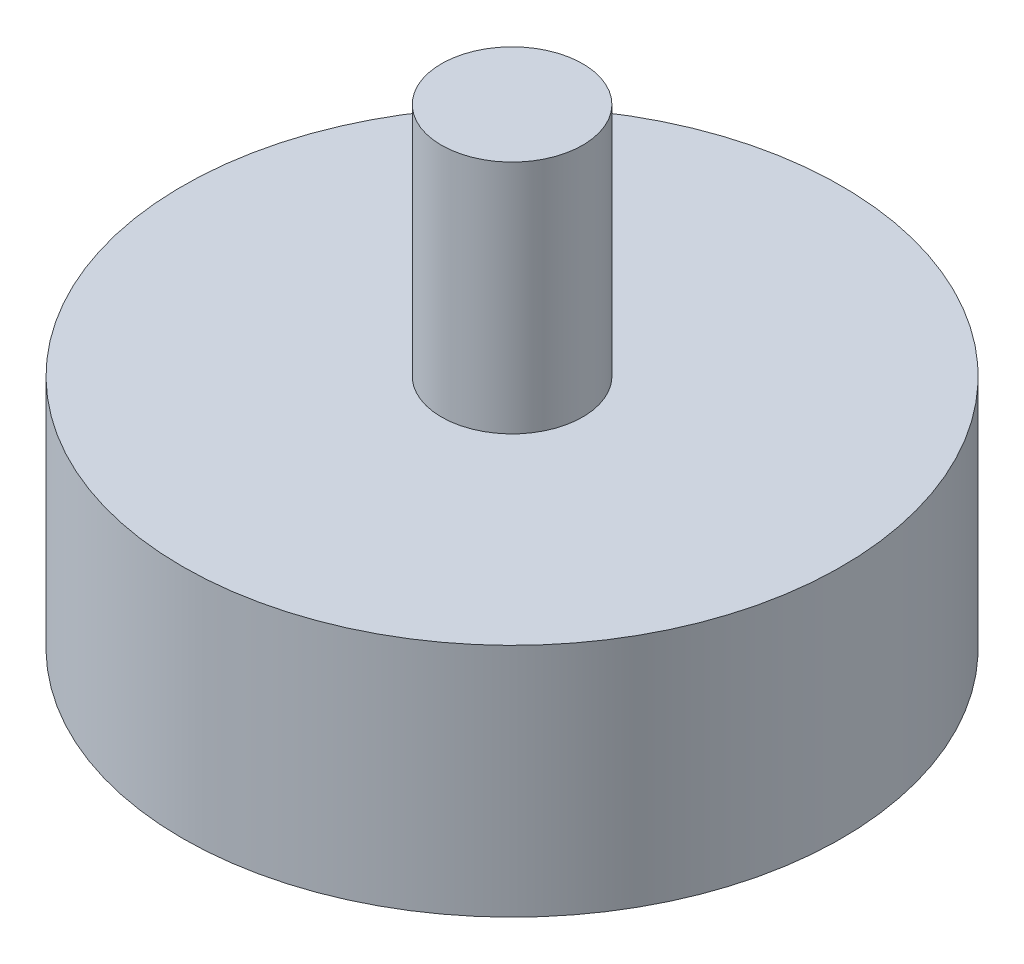
ISO-10303-21;
HEADER;
FILE_DESCRIPTION(('STEP AP214'),'2;1');
FILE_NAME('part.step','',(''),(''),'','','');
FILE_SCHEMA(('AUTOMOTIVE_DESIGN { 1 0 10303 214 1 1 1 1 }'));
ENDSEC;
DATA;
#1=APPLICATION_CONTEXT('core data for automotive mechanical design processes');
#2=APPLICATION_PROTOCOL_DEFINITION('international standard','automotive_design',2000,#1);
#3=PRODUCT_CONTEXT('',#1,'mechanical');
#4=PRODUCT('Part','Part','',(#3));
#5=PRODUCT_RELATED_PRODUCT_CATEGORY('part','',(#4));
#6=PRODUCT_DEFINITION_FORMATION('','',#4);
#7=PRODUCT_DEFINITION_CONTEXT('part definition',#1,'design');
#8=PRODUCT_DEFINITION('design','',#6,#7);
#9=PRODUCT_DEFINITION_SHAPE('','',#8);
#10=(LENGTH_UNIT() NAMED_UNIT(*) SI_UNIT(.MILLI.,.METRE.));
#11=(NAMED_UNIT(*) PLANE_ANGLE_UNIT() SI_UNIT($,.RADIAN.));
#12=(NAMED_UNIT(*) SI_UNIT($,.STERADIAN.) SOLID_ANGLE_UNIT());
#13=UNCERTAINTY_MEASURE_WITH_UNIT(LENGTH_MEASURE(1.E-05),#10,'distance_accuracy_value','');
#14=(GEOMETRIC_REPRESENTATION_CONTEXT(3) GLOBAL_UNCERTAINTY_ASSIGNED_CONTEXT((#13)) GLOBAL_UNIT_ASSIGNED_CONTEXT((#10,
#11,#12)) REPRESENTATION_CONTEXT('',''));
#15=CARTESIAN_POINT('',(0.,0.,0.));
#16=DIRECTION('',(0.,0.,1.));
#17=DIRECTION('',(1.,0.,0.));
#18=AXIS2_PLACEMENT_3D('',#15,#16,#17);
#19=CARTESIAN_POINT('',(0.,50.,0.));
#20=DIRECTION('',(0.,-1.,0.));
#21=DIRECTION('',(0.,0.,-1.));
#22=AXIS2_PLACEMENT_3D('',#19,#20,#21);
#23=CYLINDRICAL_SURFACE('',#22,70.);
#24=CARTESIAN_POINT('',(0.,50.,0.));
#25=DIRECTION('',(0.,1.,0.));
#26=DIRECTION('',(0.,0.,1.));
#27=AXIS2_PLACEMENT_3D('',#24,#25,#26);
#28=CIRCLE('',#27,70.);
#29=CARTESIAN_POINT('',(0.,50.,70.));
#30=VERTEX_POINT('',#29);
#31=EDGE_CURVE('E46',#30,#30,#28,.T.);
#32=ORIENTED_EDGE('',*,*,#31,.F.);
#33=EDGE_LOOP('',(#32));
#34=FACE_BOUND('',#33,.T.);
#35=CARTESIAN_POINT('',(0.,0.,0.));
#36=DIRECTION('',(0.,1.,0.));
#37=DIRECTION('',(0.,0.,1.));
#38=AXIS2_PLACEMENT_3D('',#35,#36,#37);
#39=CIRCLE('',#38,70.);
#40=CARTESIAN_POINT('',(0.,0.,70.));
#41=VERTEX_POINT('',#40);
#42=EDGE_CURVE('E41',#41,#41,#39,.T.);
#43=ORIENTED_EDGE('',*,*,#42,.T.);
#44=EDGE_LOOP('',(#43));
#45=FACE_BOUND('',#44,.T.);
#46=ADVANCED_FACE('F38',(#34,#45),#23,.T.);
#47=CARTESIAN_POINT('',(0.,50.,0.));
#48=DIRECTION('',(0.,1.,0.));
#49=DIRECTION('',(0.,0.,1.));
#50=AXIS2_PLACEMENT_3D('',#47,#48,#49);
#51=PLANE('',#50);
#52=CARTESIAN_POINT('',(0.,50.,0.));
#53=DIRECTION('',(0.,1.,0.));
#54=DIRECTION('',(0.,0.,1.));
#55=AXIS2_PLACEMENT_3D('',#52,#53,#54);
#56=CIRCLE('',#55,15.);
#57=CARTESIAN_POINT('',(0.,50.,15.));
#58=VERTEX_POINT('',#57);
#59=EDGE_CURVE('E11',#58,#58,#56,.T.);
#60=ORIENTED_EDGE('',*,*,#59,.F.);
#61=EDGE_LOOP('',(#60));
#62=FACE_BOUND('',#61,.T.);
#63=ORIENTED_EDGE('',*,*,#31,.T.);
#64=EDGE_LOOP('',(#63));
#65=FACE_BOUND('',#64,.T.);
#66=ADVANCED_FACE('F202',(#62,#65),#51,.T.);
#67=CARTESIAN_POINT('',(0.,0.,0.));
#68=DIRECTION('',(0.,1.,0.));
#69=DIRECTION('',(0.,0.,1.));
#70=AXIS2_PLACEMENT_3D('',#67,#68,#69);
#71=PLANE('',#70);
#72=DIRECTION('',(-0.589540314689546,0.,-0.807738953719425));
#73=VECTOR('',#72,1.);
#74=CARTESIAN_POINT('',(-20.1581224957302,0.,-16.5040988934656));
#75=LINE('',#74,#73);
#76=CARTESIAN_POINT('',(0.,0.,11.11487875393));
#77=VERTEX_POINT('',#76);
#78=CARTESIAN_POINT('',(-20.1581224957302,0.,-16.5040988934656));
#79=VERTEX_POINT('',#78);
#80=EDGE_CURVE('E152',#77,#79,#75,.T.);
#81=ORIENTED_EDGE('',*,*,#80,.F.);
#82=DIRECTION('',(1.,0.,0.));
#83=VECTOR('',#82,1.);
#84=CARTESIAN_POINT('',(0.,0.,11.11487875393));
#85=LINE('',#84,#83);
#86=CARTESIAN_POINT('',(-16.1920608767958,0.,11.11487875393));
#87=VERTEX_POINT('',#86);
#88=EDGE_CURVE('E54',#87,#77,#85,.T.);
#89=ORIENTED_EDGE('',*,*,#88,.F.);
#90=DIRECTION('',(-0.675312692510139,0.,-0.7375315365018));
#91=VECTOR('',#90,1.);
#92=CARTESIAN_POINT('',(-16.1920608767958,0.,11.11487875393));
#93=LINE('',#92,#91);
#94=CARTESIAN_POINT('',(27.54081994348,0.,58.8770179003727));
#95=VERTEX_POINT('',#94);
#96=EDGE_CURVE('E173',#95,#87,#93,.T.);
#97=ORIENTED_EDGE('',*,*,#96,.F.);
#98=DIRECTION('',(0.399355986863506,0.,0.916795940084965));
#99=VECTOR('',#98,1.);
#100=CARTESIAN_POINT('',(27.54081994348,0.,58.8770179003727));
#101=LINE('',#100,#99);
#102=CARTESIAN_POINT('',(10.1115671953132,0.,18.864926723947));
#103=VERTEX_POINT('',#102);
#104=EDGE_CURVE('E171',#103,#95,#101,.T.);
#105=ORIENTED_EDGE('',*,*,#104,.F.);
#106=DIRECTION('',(-1.,0.,0.));
#107=VECTOR('',#106,1.);
#108=CARTESIAN_POINT('',(10.1115671953132,0.,18.864926723947));
#109=LINE('',#108,#107);
#110=CARTESIAN_POINT('',(21.8812078758533,0.,18.864926723947));
#111=VERTEX_POINT('',#110);
#112=EDGE_CURVE('E126',#111,#103,#109,.T.);
#113=ORIENTED_EDGE('',*,*,#112,.F.);
#114=DIRECTION('',(0.589540314689546,0.,0.807738953719425));
#115=VECTOR('',#114,1.);
#116=CARTESIAN_POINT('',(21.8812078758533,0.,18.864926723947));
#117=LINE('',#116,#115);
#118=CARTESIAN_POINT('',(0.,0.,-11.11487875393));
#119=VERTEX_POINT('',#118);
#120=EDGE_CURVE('E167',#119,#111,#117,.T.);
#121=ORIENTED_EDGE('',*,*,#120,.F.);
#122=DIRECTION('',(-1.,0.,0.));
#123=VECTOR('',#122,1.);
#124=CARTESIAN_POINT('',(0.,0.,-11.11487875393));
#125=LINE('',#124,#123);
#126=CARTESIAN_POINT('',(16.1920608767958,0.,-11.11487875393));
#127=VERTEX_POINT('',#126);
#128=EDGE_CURVE('E164',#127,#119,#125,.T.);
#129=ORIENTED_EDGE('',*,*,#128,.F.);
#130=DIRECTION('',(0.675312692510139,0.,0.7375315365018));
#131=VECTOR('',#130,1.);
#132=CARTESIAN_POINT('',(16.1920608767958,0.,-11.11487875393));
#133=LINE('',#132,#131);
#134=CARTESIAN_POINT('',(-27.54081994348,0.,-58.8770179003727));
#135=VERTEX_POINT('',#134);
#136=EDGE_CURVE('E161',#135,#127,#133,.T.);
#137=ORIENTED_EDGE('',*,*,#136,.F.);
#138=DIRECTION('',(-0.411875732455759,0.,-0.911240023821403));
#139=VECTOR('',#138,1.);
#140=CARTESIAN_POINT('',(-27.54081994348,0.,-58.8770179003727));
#141=LINE('',#140,#139);
#142=CARTESIAN_POINT('',(-8.38848181519014,0.,-16.5040988934656));
#143=VERTEX_POINT('',#142);
#144=EDGE_CURVE('E158',#143,#135,#141,.T.);
#145=ORIENTED_EDGE('',*,*,#144,.F.);
#146=DIRECTION('',(1.,0.,0.));
#147=VECTOR('',#146,1.);
#148=CARTESIAN_POINT('',(-8.38848181519014,0.,-16.5040988934656));
#149=LINE('',#148,#147);
#150=EDGE_CURVE('E155',#79,#143,#149,.T.);
#151=ORIENTED_EDGE('',*,*,#150,.F.);
#152=EDGE_LOOP('',(#81,#89,#97,#105,#113,#121,#129,#137,#145,#151));
#153=FACE_BOUND('',#152,.T.);
#154=ORIENTED_EDGE('',*,*,#42,.F.);
#155=EDGE_LOOP('',(#154));
#156=FACE_BOUND('',#155,.T.);
#157=ADVANCED_FACE('F199',(#153,#156),#71,.F.);
#158=CARTESIAN_POINT('',(0.,100.,0.));
#159=DIRECTION('',(0.,-1.,0.));
#160=DIRECTION('',(0.,0.,-1.));
#161=AXIS2_PLACEMENT_3D('',#158,#159,#160);
#162=CYLINDRICAL_SURFACE('',#161,15.);
#163=CARTESIAN_POINT('',(0.,100.,0.));
#164=DIRECTION('',(0.,1.,0.));
#165=DIRECTION('',(0.,0.,1.));
#166=AXIS2_PLACEMENT_3D('',#163,#164,#165);
#167=CIRCLE('',#166,15.);
#168=CARTESIAN_POINT('',(0.,100.,15.));
#169=VERTEX_POINT('',#168);
#170=EDGE_CURVE('E177',#169,#169,#167,.T.);
#171=ORIENTED_EDGE('',*,*,#170,.F.);
#172=EDGE_LOOP('',(#171));
#173=FACE_BOUND('',#172,.T.);
#174=ORIENTED_EDGE('',*,*,#59,.T.);
#175=EDGE_LOOP('',(#174));
#176=FACE_BOUND('',#175,.T.);
#177=ADVANCED_FACE('F201',(#173,#176),#162,.T.);
#178=CARTESIAN_POINT('',(0.,100.,0.));
#179=DIRECTION('',(0.,1.,0.));
#180=DIRECTION('',(0.,0.,1.));
#181=AXIS2_PLACEMENT_3D('',#178,#179,#180);
#182=PLANE('',#181);
#183=ORIENTED_EDGE('',*,*,#170,.T.);
#184=EDGE_LOOP('',(#183));
#185=FACE_BOUND('',#184,.T.);
#186=ADVANCED_FACE('F208',(#185),#182,.T.);
#187=CARTESIAN_POINT('',(0.,5.,11.11487875393));
#188=DIRECTION('',(0.,0.,-1.));
#189=DIRECTION('',(-1.,0.,0.));
#190=AXIS2_PLACEMENT_3D('',#187,#188,#189);
#191=PLANE('',#190);
#192=ORIENTED_EDGE('',*,*,#88,.T.);
#193=DIRECTION('',(0.,-1.,0.));
#194=VECTOR('',#193,1.);
#195=CARTESIAN_POINT('',(0.,5.,11.11487875393));
#196=LINE('',#195,#194);
#197=CARTESIAN_POINT('',(0.,5.,11.11487875393));
#198=VERTEX_POINT('',#197);
#199=EDGE_CURVE('E96',#198,#77,#196,.T.);
#200=ORIENTED_EDGE('',*,*,#199,.F.);
#201=DIRECTION('',(1.,0.,0.));
#202=VECTOR('',#201,1.);
#203=CARTESIAN_POINT('',(0.,5.,11.11487875393));
#204=LINE('',#203,#202);
#205=CARTESIAN_POINT('',(-16.1920608767958,5.,11.11487875393));
#206=VERTEX_POINT('',#205);
#207=EDGE_CURVE('E175',#206,#198,#204,.T.);
#208=ORIENTED_EDGE('',*,*,#207,.F.);
#209=DIRECTION('',(0.,-1.,0.));
#210=VECTOR('',#209,1.);
#211=CARTESIAN_POINT('',(-16.1920608767958,5.,11.11487875393));
#212=LINE('',#211,#210);
#213=EDGE_CURVE('E62',#206,#87,#212,.T.);
#214=ORIENTED_EDGE('',*,*,#213,.T.);
#215=EDGE_LOOP('',(#192,#200,#208,#214));
#216=FACE_BOUND('',#215,.T.);
#217=ADVANCED_FACE('F238',(#216),#191,.F.);
#218=CARTESIAN_POINT('',(-16.1920608767958,5.,11.11487875393));
#219=DIRECTION('',(-0.7375315365018,0.,0.675312692510139));
#220=DIRECTION('',(0.675312692510139,0.,0.7375315365018));
#221=AXIS2_PLACEMENT_3D('',#218,#219,#220);
#222=PLANE('',#221);
#223=ORIENTED_EDGE('',*,*,#96,.T.);
#224=ORIENTED_EDGE('',*,*,#213,.F.);
#225=DIRECTION('',(-0.675312692510139,0.,-0.7375315365018));
#226=VECTOR('',#225,1.);
#227=CARTESIAN_POINT('',(-16.1920608767958,5.,11.11487875393));
#228=LINE('',#227,#226);
#229=CARTESIAN_POINT('',(27.54081994348,5.,58.8770179003727));
#230=VERTEX_POINT('',#229);
#231=EDGE_CURVE('E138',#230,#206,#228,.T.);
#232=ORIENTED_EDGE('',*,*,#231,.F.);
#233=DIRECTION('',(0.,-1.,0.));
#234=VECTOR('',#233,1.);
#235=CARTESIAN_POINT('',(27.54081994348,5.,58.8770179003727));
#236=LINE('',#235,#234);
#237=EDGE_CURVE('E130',#230,#95,#236,.T.);
#238=ORIENTED_EDGE('',*,*,#237,.T.);
#239=EDGE_LOOP('',(#223,#224,#232,#238));
#240=FACE_BOUND('',#239,.T.);
#241=ADVANCED_FACE('F253',(#240),#222,.F.);
#242=CARTESIAN_POINT('',(27.54081994348,5.,58.8770179003727));
#243=DIRECTION('',(0.916795940084966,0.,-0.399355986863506));
#244=DIRECTION('',(-0.399355986863506,0.,-0.916795940084966));
#245=AXIS2_PLACEMENT_3D('',#242,#243,#244);
#246=PLANE('',#245);
#247=ORIENTED_EDGE('',*,*,#104,.T.);
#248=ORIENTED_EDGE('',*,*,#237,.F.);
#249=DIRECTION('',(0.399355986863506,0.,0.916795940084965));
#250=VECTOR('',#249,1.);
#251=CARTESIAN_POINT('',(27.54081994348,5.,58.8770179003727));
#252=LINE('',#251,#250);
#253=CARTESIAN_POINT('',(10.1115671953132,5.,18.864926723947));
#254=VERTEX_POINT('',#253);
#255=EDGE_CURVE('E134',#254,#230,#252,.T.);
#256=ORIENTED_EDGE('',*,*,#255,.F.);
#257=DIRECTION('',(0.,-1.,0.));
#258=VECTOR('',#257,1.);
#259=CARTESIAN_POINT('',(10.1115671953132,5.,18.864926723947));
#260=LINE('',#259,#258);
#261=EDGE_CURVE('E119',#254,#103,#260,.T.);
#262=ORIENTED_EDGE('',*,*,#261,.T.);
#263=EDGE_LOOP('',(#247,#248,#256,#262));
#264=FACE_BOUND('',#263,.T.);
#265=ADVANCED_FACE('F135',(#264),#246,.F.);
#266=CARTESIAN_POINT('',(10.1115671953132,5.,18.864926723947));
#267=DIRECTION('',(0.,0.,1.));
#268=DIRECTION('',(1.,0.,0.));
#269=AXIS2_PLACEMENT_3D('',#266,#267,#268);
#270=PLANE('',#269);
#271=ORIENTED_EDGE('',*,*,#112,.T.);
#272=ORIENTED_EDGE('',*,*,#261,.F.);
#273=DIRECTION('',(-1.,0.,0.));
#274=VECTOR('',#273,1.);
#275=CARTESIAN_POINT('',(10.1115671953132,5.,18.864926723947));
#276=LINE('',#275,#274);
#277=CARTESIAN_POINT('',(21.8812078758533,5.,18.864926723947));
#278=VERTEX_POINT('',#277);
#279=EDGE_CURVE('E123',#278,#254,#276,.T.);
#280=ORIENTED_EDGE('',*,*,#279,.F.);
#281=DIRECTION('',(0.,-1.,0.));
#282=VECTOR('',#281,1.);
#283=CARTESIAN_POINT('',(21.8812078758533,5.,18.864926723947));
#284=LINE('',#283,#282);
#285=EDGE_CURVE('E131',#278,#111,#284,.T.);
#286=ORIENTED_EDGE('',*,*,#285,.T.);
#287=EDGE_LOOP('',(#271,#272,#280,#286));
#288=FACE_BOUND('',#287,.T.);
#289=ADVANCED_FACE('F121',(#288),#270,.F.);
#290=CARTESIAN_POINT('',(21.8812078758533,5.,18.864926723947));
#291=DIRECTION('',(0.807738953719425,0.,-0.589540314689546));
#292=DIRECTION('',(-0.589540314689546,0.,-0.807738953719425));
#293=AXIS2_PLACEMENT_3D('',#290,#291,#292);
#294=PLANE('',#293);
#295=ORIENTED_EDGE('',*,*,#120,.T.);
#296=ORIENTED_EDGE('',*,*,#285,.F.);
#297=DIRECTION('',(0.589540314689546,0.,0.807738953719425));
#298=VECTOR('',#297,1.);
#299=CARTESIAN_POINT('',(21.8812078758533,5.,18.864926723947));
#300=LINE('',#299,#298);
#301=CARTESIAN_POINT('',(0.,5.,-11.11487875393));
#302=VERTEX_POINT('',#301);
#303=EDGE_CURVE('E144',#302,#278,#300,.T.);
#304=ORIENTED_EDGE('',*,*,#303,.F.);
#305=DIRECTION('',(0.,-1.,0.));
#306=VECTOR('',#305,1.);
#307=CARTESIAN_POINT('',(0.,5.,-11.11487875393));
#308=LINE('',#307,#306);
#309=EDGE_CURVE('E180',#302,#119,#308,.T.);
#310=ORIENTED_EDGE('',*,*,#309,.T.);
#311=EDGE_LOOP('',(#295,#296,#304,#310));
#312=FACE_BOUND('',#311,.T.);
#313=ADVANCED_FACE('F278',(#312),#294,.F.);
#314=CARTESIAN_POINT('',(0.,5.,-11.11487875393));
#315=DIRECTION('',(0.,0.,1.));
#316=DIRECTION('',(1.,0.,0.));
#317=AXIS2_PLACEMENT_3D('',#314,#315,#316);
#318=PLANE('',#317);
#319=ORIENTED_EDGE('',*,*,#128,.T.);
#320=ORIENTED_EDGE('',*,*,#309,.F.);
#321=DIRECTION('',(-1.,0.,0.));
#322=VECTOR('',#321,1.);
#323=CARTESIAN_POINT('',(0.,5.,-11.11487875393));
#324=LINE('',#323,#322);
#325=CARTESIAN_POINT('',(16.1920608767958,5.,-11.11487875393));
#326=VERTEX_POINT('',#325);
#327=EDGE_CURVE('E146',#326,#302,#324,.T.);
#328=ORIENTED_EDGE('',*,*,#327,.F.);
#329=DIRECTION('',(0.,-1.,0.));
#330=VECTOR('',#329,1.);
#331=CARTESIAN_POINT('',(16.1920608767958,5.,-11.11487875393));
#332=LINE('',#331,#330);
#333=EDGE_CURVE('E182',#326,#127,#332,.T.);
#334=ORIENTED_EDGE('',*,*,#333,.T.);
#335=EDGE_LOOP('',(#319,#320,#328,#334));
#336=FACE_BOUND('',#335,.T.);
#337=ADVANCED_FACE('F287',(#336),#318,.F.);
#338=CARTESIAN_POINT('',(16.1920608767958,5.,-11.11487875393));
#339=DIRECTION('',(0.7375315365018,0.,-0.675312692510139));
#340=DIRECTION('',(-0.675312692510139,0.,-0.7375315365018));
#341=AXIS2_PLACEMENT_3D('',#338,#339,#340);
#342=PLANE('',#341);
#343=ORIENTED_EDGE('',*,*,#136,.T.);
#344=ORIENTED_EDGE('',*,*,#333,.F.);
#345=DIRECTION('',(0.675312692510139,0.,0.7375315365018));
#346=VECTOR('',#345,1.);
#347=CARTESIAN_POINT('',(16.1920608767958,5.,-11.11487875393));
#348=LINE('',#347,#346);
#349=CARTESIAN_POINT('',(-27.54081994348,5.,-58.8770179003727));
#350=VERTEX_POINT('',#349);
#351=EDGE_CURVE('E365',#350,#326,#348,.T.);
#352=ORIENTED_EDGE('',*,*,#351,.F.);
#353=DIRECTION('',(0.,-1.,0.));
#354=VECTOR('',#353,1.);
#355=CARTESIAN_POINT('',(-27.54081994348,5.,-58.8770179003727));
#356=LINE('',#355,#354);
#357=EDGE_CURVE('E184',#350,#135,#356,.T.);
#358=ORIENTED_EDGE('',*,*,#357,.T.);
#359=EDGE_LOOP('',(#343,#344,#352,#358));
#360=FACE_BOUND('',#359,.T.);
#361=ADVANCED_FACE('F297',(#360),#342,.F.);
#362=CARTESIAN_POINT('',(-27.54081994348,5.,-58.8770179003727));
#363=DIRECTION('',(-0.911240023821403,0.,0.411875732455759));
#364=DIRECTION('',(0.411875732455759,0.,0.911240023821403));
#365=AXIS2_PLACEMENT_3D('',#362,#363,#364);
#366=PLANE('',#365);
#367=ORIENTED_EDGE('',*,*,#144,.T.);
#368=ORIENTED_EDGE('',*,*,#357,.F.);
#369=DIRECTION('',(-0.411875732455759,0.,-0.911240023821403));
#370=VECTOR('',#369,1.);
#371=CARTESIAN_POINT('',(-27.54081994348,5.,-58.8770179003727));
#372=LINE('',#371,#370);
#373=CARTESIAN_POINT('',(-8.38848181519014,5.,-16.5040988934656));
#374=VERTEX_POINT('',#373);
#375=EDGE_CURVE('E358',#374,#350,#372,.T.);
#376=ORIENTED_EDGE('',*,*,#375,.F.);
#377=DIRECTION('',(0.,-1.,0.));
#378=VECTOR('',#377,1.);
#379=CARTESIAN_POINT('',(-8.38848181519014,5.,-16.5040988934656));
#380=LINE('',#379,#378);
#381=EDGE_CURVE('E186',#374,#143,#380,.T.);
#382=ORIENTED_EDGE('',*,*,#381,.T.);
#383=EDGE_LOOP('',(#367,#368,#376,#382));
#384=FACE_BOUND('',#383,.T.);
#385=ADVANCED_FACE('F307',(#384),#366,.F.);
#386=CARTESIAN_POINT('',(-8.38848181519014,5.,-16.5040988934656));
#387=DIRECTION('',(0.,0.,-1.));
#388=DIRECTION('',(-1.,0.,0.));
#389=AXIS2_PLACEMENT_3D('',#386,#387,#388);
#390=PLANE('',#389);
#391=ORIENTED_EDGE('',*,*,#150,.T.);
#392=ORIENTED_EDGE('',*,*,#381,.F.);
#393=DIRECTION('',(1.,0.,0.));
#394=VECTOR('',#393,1.);
#395=CARTESIAN_POINT('',(-8.38848181519014,5.,-16.5040988934656));
#396=LINE('',#395,#394);
#397=CARTESIAN_POINT('',(-20.1581224957302,5.,-16.5040988934656));
#398=VERTEX_POINT('',#397);
#399=EDGE_CURVE('E355',#398,#374,#396,.T.);
#400=ORIENTED_EDGE('',*,*,#399,.F.);
#401=DIRECTION('',(0.,-1.,0.));
#402=VECTOR('',#401,1.);
#403=CARTESIAN_POINT('',(-20.1581224957302,5.,-16.5040988934656));
#404=LINE('',#403,#402);
#405=EDGE_CURVE('E188',#398,#79,#404,.T.);
#406=ORIENTED_EDGE('',*,*,#405,.T.);
#407=EDGE_LOOP('',(#391,#392,#400,#406));
#408=FACE_BOUND('',#407,.T.);
#409=ADVANCED_FACE('F317',(#408),#390,.F.);
#410=CARTESIAN_POINT('',(-20.1581224957302,5.,-16.5040988934656));
#411=DIRECTION('',(-0.807738953719425,0.,0.589540314689546));
#412=DIRECTION('',(0.589540314689546,0.,0.807738953719425));
#413=AXIS2_PLACEMENT_3D('',#410,#411,#412);
#414=PLANE('',#413);
#415=ORIENTED_EDGE('',*,*,#80,.T.);
#416=ORIENTED_EDGE('',*,*,#405,.F.);
#417=DIRECTION('',(-0.589540314689546,0.,-0.807738953719425));
#418=VECTOR('',#417,1.);
#419=CARTESIAN_POINT('',(-20.1581224957302,5.,-16.5040988934656));
#420=LINE('',#419,#418);
#421=EDGE_CURVE('E359',#198,#398,#420,.T.);
#422=ORIENTED_EDGE('',*,*,#421,.F.);
#423=ORIENTED_EDGE('',*,*,#199,.T.);
#424=EDGE_LOOP('',(#415,#416,#422,#423));
#425=FACE_BOUND('',#424,.T.);
#426=ADVANCED_FACE('F327',(#425),#414,.F.);
#427=CARTESIAN_POINT('',(0.,5.,0.));
#428=DIRECTION('',(0.,-1.,0.));
#429=DIRECTION('',(0.,0.,-1.));
#430=AXIS2_PLACEMENT_3D('',#427,#428,#429);
#431=PLANE('',#430);
#432=ORIENTED_EDGE('',*,*,#207,.T.);
#433=ORIENTED_EDGE('',*,*,#421,.T.);
#434=ORIENTED_EDGE('',*,*,#399,.T.);
#435=ORIENTED_EDGE('',*,*,#375,.T.);
#436=ORIENTED_EDGE('',*,*,#351,.T.);
#437=ORIENTED_EDGE('',*,*,#327,.T.);
#438=ORIENTED_EDGE('',*,*,#303,.T.);
#439=ORIENTED_EDGE('',*,*,#279,.T.);
#440=ORIENTED_EDGE('',*,*,#255,.T.);
#441=ORIENTED_EDGE('',*,*,#231,.T.);
#442=EDGE_LOOP('',(#432,#433,#434,#435,#436,#437,#438,#439,#440,#441));
#443=FACE_BOUND('',#442,.T.);
#444=ADVANCED_FACE('F141',(#443),#431,.T.);
#445=CLOSED_SHELL('',(#46,#66,#157,#177,#186,#217,#241,#265,#289,#313,#337,#361,#385,#409,#426,#444));
#446=MANIFOLD_SOLID_BREP('B2',#445);
#447=ADVANCED_BREP_SHAPE_REPRESENTATION('',(#18,#446),#14);
#448=SHAPE_DEFINITION_REPRESENTATION(#9,#447);
ENDSEC;
END-ISO-10303-21;
